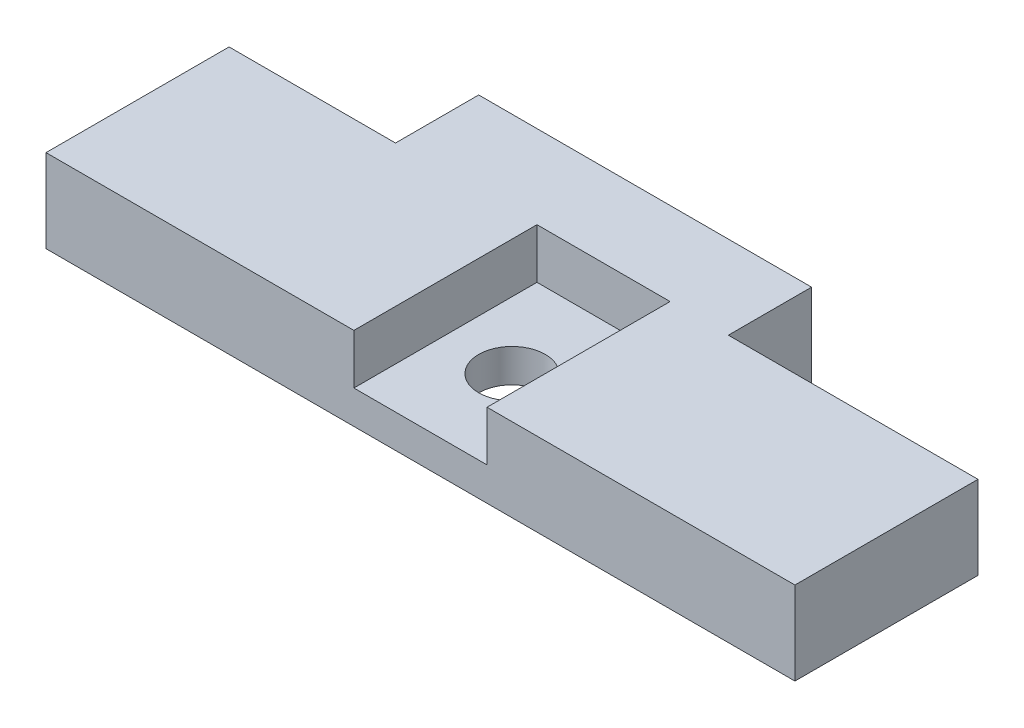
ISO-10303-21;
HEADER;
FILE_DESCRIPTION(('STEP AP214'),'2;1');
FILE_NAME('part.step','',(''),(''),'','','');
FILE_SCHEMA(('AUTOMOTIVE_DESIGN { 1 0 10303 214 1 1 1 1 }'));
ENDSEC;
DATA;
#1=APPLICATION_CONTEXT('core data for automotive mechanical design processes');
#2=APPLICATION_PROTOCOL_DEFINITION('international standard','automotive_design',2000,#1);
#3=PRODUCT_CONTEXT('',#1,'mechanical');
#4=PRODUCT('Part','Part','',(#3));
#5=PRODUCT_RELATED_PRODUCT_CATEGORY('part','',(#4));
#6=PRODUCT_DEFINITION_FORMATION('','',#4);
#7=PRODUCT_DEFINITION_CONTEXT('part definition',#1,'design');
#8=PRODUCT_DEFINITION('design','',#6,#7);
#9=PRODUCT_DEFINITION_SHAPE('','',#8);
#10=(LENGTH_UNIT() NAMED_UNIT(*) SI_UNIT(.MILLI.,.METRE.));
#11=(NAMED_UNIT(*) PLANE_ANGLE_UNIT() SI_UNIT($,.RADIAN.));
#12=(NAMED_UNIT(*) SI_UNIT($,.STERADIAN.) SOLID_ANGLE_UNIT());
#13=UNCERTAINTY_MEASURE_WITH_UNIT(LENGTH_MEASURE(1.E-05),#10,'distance_accuracy_value','');
#14=(GEOMETRIC_REPRESENTATION_CONTEXT(3) GLOBAL_UNCERTAINTY_ASSIGNED_CONTEXT((#13)) GLOBAL_UNIT_ASSIGNED_CONTEXT((#10,
#11,#12)) REPRESENTATION_CONTEXT('',''));
#15=CARTESIAN_POINT('',(0.,0.,0.));
#16=DIRECTION('',(0.,0.,1.));
#17=DIRECTION('',(1.,0.,0.));
#18=AXIS2_PLACEMENT_3D('',#15,#16,#17);
#19=CARTESIAN_POINT('',(22.5,5.,-3.));
#20=DIRECTION('',(-1.,0.,0.));
#21=DIRECTION('',(0.,0.,1.));
#22=AXIS2_PLACEMENT_3D('',#19,#20,#21);
#23=PLANE('',#22);
#24=DIRECTION('',(0.,0.,-1.));
#25=VECTOR('',#24,1.);
#26=CARTESIAN_POINT('',(22.5,0.,-3.));
#27=LINE('',#26,#25);
#28=CARTESIAN_POINT('',(22.5,0.,8.));
#29=VERTEX_POINT('',#28);
#30=CARTESIAN_POINT('',(22.5,0.,-3.));
#31=VERTEX_POINT('',#30);
#32=EDGE_CURVE('E144',#29,#31,#27,.T.);
#33=ORIENTED_EDGE('',*,*,#32,.T.);
#34=DIRECTION('',(0.,-1.,0.));
#35=VECTOR('',#34,1.);
#36=CARTESIAN_POINT('',(22.5,5.,-3.));
#37=LINE('',#36,#35);
#38=CARTESIAN_POINT('',(22.5,5.,-3.));
#39=VERTEX_POINT('',#38);
#40=EDGE_CURVE('E11',#39,#31,#37,.T.);
#41=ORIENTED_EDGE('',*,*,#40,.F.);
#42=DIRECTION('',(0.,0.,-1.));
#43=VECTOR('',#42,1.);
#44=CARTESIAN_POINT('',(22.5,5.,-3.));
#45=LINE('',#44,#43);
#46=CARTESIAN_POINT('',(22.5,5.,8.));
#47=VERTEX_POINT('',#46);
#48=EDGE_CURVE('E160',#47,#39,#45,.T.);
#49=ORIENTED_EDGE('',*,*,#48,.F.);
#50=DIRECTION('',(0.,-1.,0.));
#51=VECTOR('',#50,1.);
#52=CARTESIAN_POINT('',(22.5,5.,8.));
#53=LINE('',#52,#51);
#54=EDGE_CURVE('E143',#47,#29,#53,.T.);
#55=ORIENTED_EDGE('',*,*,#54,.T.);
#56=EDGE_LOOP('',(#33,#41,#49,#55));
#57=FACE_BOUND('',#56,.T.);
#58=ADVANCED_FACE('F33',(#57),#23,.F.);
#59=CARTESIAN_POINT('',(7.49999999999999,5.,-3.));
#60=DIRECTION('',(0.,0.,1.));
#61=DIRECTION('',(1.,0.,0.));
#62=AXIS2_PLACEMENT_3D('',#59,#60,#61);
#63=PLANE('',#62);
#64=DIRECTION('',(-1.,0.,0.));
#65=VECTOR('',#64,1.);
#66=CARTESIAN_POINT('',(7.49999999999999,0.,-3.));
#67=LINE('',#66,#65);
#68=CARTESIAN_POINT('',(7.49999999999999,0.,-3.));
#69=VERTEX_POINT('',#68);
#70=EDGE_CURVE('E147',#31,#69,#67,.T.);
#71=ORIENTED_EDGE('',*,*,#70,.T.);
#72=DIRECTION('',(0.,-1.,0.));
#73=VECTOR('',#72,1.);
#74=CARTESIAN_POINT('',(7.49999999999999,5.,-3.));
#75=LINE('',#74,#73);
#76=CARTESIAN_POINT('',(7.49999999999999,5.,-3.));
#77=VERTEX_POINT('',#76);
#78=EDGE_CURVE('E40',#77,#69,#75,.T.);
#79=ORIENTED_EDGE('',*,*,#78,.F.);
#80=DIRECTION('',(-1.,0.,0.));
#81=VECTOR('',#80,1.);
#82=CARTESIAN_POINT('',(7.49999999999999,5.,-3.));
#83=LINE('',#82,#81);
#84=EDGE_CURVE('E97',#39,#77,#83,.T.);
#85=ORIENTED_EDGE('',*,*,#84,.F.);
#86=ORIENTED_EDGE('',*,*,#40,.T.);
#87=EDGE_LOOP('',(#71,#79,#85,#86));
#88=FACE_BOUND('',#87,.T.);
#89=ADVANCED_FACE('F266',(#88),#63,.F.);
#90=CARTESIAN_POINT('',(7.49999999999999,5.,-8.));
#91=DIRECTION('',(-1.,0.,0.));
#92=DIRECTION('',(0.,0.,1.));
#93=AXIS2_PLACEMENT_3D('',#90,#91,#92);
#94=PLANE('',#93);
#95=DIRECTION('',(0.,0.,-1.));
#96=VECTOR('',#95,1.);
#97=CARTESIAN_POINT('',(7.49999999999999,0.,-8.));
#98=LINE('',#97,#96);
#99=CARTESIAN_POINT('',(7.49999999999999,0.,-8.));
#100=VERTEX_POINT('',#99);
#101=EDGE_CURVE('E150',#69,#100,#98,.T.);
#102=ORIENTED_EDGE('',*,*,#101,.T.);
#103=DIRECTION('',(0.,-1.,0.));
#104=VECTOR('',#103,1.);
#105=CARTESIAN_POINT('',(7.49999999999999,5.,-8.));
#106=LINE('',#105,#104);
#107=CARTESIAN_POINT('',(7.49999999999999,5.,-8.));
#108=VERTEX_POINT('',#107);
#109=EDGE_CURVE('E167',#108,#100,#106,.T.);
#110=ORIENTED_EDGE('',*,*,#109,.F.);
#111=DIRECTION('',(0.,0.,-1.));
#112=VECTOR('',#111,1.);
#113=CARTESIAN_POINT('',(7.49999999999999,5.,-8.));
#114=LINE('',#113,#112);
#115=EDGE_CURVE('E175',#77,#108,#114,.T.);
#116=ORIENTED_EDGE('',*,*,#115,.F.);
#117=ORIENTED_EDGE('',*,*,#78,.T.);
#118=EDGE_LOOP('',(#102,#110,#116,#117));
#119=FACE_BOUND('',#118,.T.);
#120=ADVANCED_FACE('F173',(#119),#94,.F.);
#121=CARTESIAN_POINT('',(-12.5,5.,-8.));
#122=DIRECTION('',(0.,0.,1.));
#123=DIRECTION('',(1.,0.,0.));
#124=AXIS2_PLACEMENT_3D('',#121,#122,#123);
#125=PLANE('',#124);
#126=DIRECTION('',(-1.,0.,0.));
#127=VECTOR('',#126,1.);
#128=CARTESIAN_POINT('',(-12.5,0.,-8.));
#129=LINE('',#128,#127);
#130=CARTESIAN_POINT('',(-12.5,0.,-8.));
#131=VERTEX_POINT('',#130);
#132=EDGE_CURVE('E152',#100,#131,#129,.T.);
#133=ORIENTED_EDGE('',*,*,#132,.T.);
#134=DIRECTION('',(0.,-1.,0.));
#135=VECTOR('',#134,1.);
#136=CARTESIAN_POINT('',(-12.5,5.,-8.));
#137=LINE('',#136,#135);
#138=CARTESIAN_POINT('',(-12.5,5.,-8.));
#139=VERTEX_POINT('',#138);
#140=EDGE_CURVE('E164',#139,#131,#137,.T.);
#141=ORIENTED_EDGE('',*,*,#140,.F.);
#142=DIRECTION('',(-1.,0.,0.));
#143=VECTOR('',#142,1.);
#144=CARTESIAN_POINT('',(-12.5,5.,-8.));
#145=LINE('',#144,#143);
#146=EDGE_CURVE('E187',#108,#139,#145,.T.);
#147=ORIENTED_EDGE('',*,*,#146,.F.);
#148=ORIENTED_EDGE('',*,*,#109,.T.);
#149=EDGE_LOOP('',(#133,#141,#147,#148));
#150=FACE_BOUND('',#149,.T.);
#151=ADVANCED_FACE('F183',(#150),#125,.F.);
#152=CARTESIAN_POINT('',(-12.5,5.,-8.));
#153=DIRECTION('',(1.,0.,0.));
#154=DIRECTION('',(0.,0.,-1.));
#155=AXIS2_PLACEMENT_3D('',#152,#153,#154);
#156=PLANE('',#155);
#157=DIRECTION('',(0.,0.,1.));
#158=VECTOR('',#157,1.);
#159=CARTESIAN_POINT('',(-12.5,0.,-8.));
#160=LINE('',#159,#158);
#161=CARTESIAN_POINT('',(-12.5,0.,-3.));
#162=VERTEX_POINT('',#161);
#163=EDGE_CURVE('E154',#131,#162,#160,.T.);
#164=ORIENTED_EDGE('',*,*,#163,.T.);
#165=DIRECTION('',(0.,-1.,0.));
#166=VECTOR('',#165,1.);
#167=CARTESIAN_POINT('',(-12.5,5.,-3.));
#168=LINE('',#167,#166);
#169=CARTESIAN_POINT('',(-12.5,5.,-3.));
#170=VERTEX_POINT('',#169);
#171=EDGE_CURVE('E133',#170,#162,#168,.T.);
#172=ORIENTED_EDGE('',*,*,#171,.F.);
#173=DIRECTION('',(0.,0.,1.));
#174=VECTOR('',#173,1.);
#175=CARTESIAN_POINT('',(-12.5,5.,-8.));
#176=LINE('',#175,#174);
#177=EDGE_CURVE('E121',#139,#170,#176,.T.);
#178=ORIENTED_EDGE('',*,*,#177,.F.);
#179=ORIENTED_EDGE('',*,*,#140,.T.);
#180=EDGE_LOOP('',(#164,#172,#178,#179));
#181=FACE_BOUND('',#180,.T.);
#182=ADVANCED_FACE('F186',(#181),#156,.F.);
#183=CARTESIAN_POINT('',(-12.5,5.,-3.));
#184=DIRECTION('',(0.,0.,1.));
#185=DIRECTION('',(1.,0.,0.));
#186=AXIS2_PLACEMENT_3D('',#183,#184,#185);
#187=PLANE('',#186);
#188=DIRECTION('',(-1.,0.,0.));
#189=VECTOR('',#188,1.);
#190=CARTESIAN_POINT('',(-12.5,0.,-3.));
#191=LINE('',#190,#189);
#192=CARTESIAN_POINT('',(-22.5,0.,-3.));
#193=VERTEX_POINT('',#192);
#194=EDGE_CURVE('E130',#162,#193,#191,.T.);
#195=ORIENTED_EDGE('',*,*,#194,.T.);
#196=DIRECTION('',(0.,-1.,0.));
#197=VECTOR('',#196,1.);
#198=CARTESIAN_POINT('',(-22.5,5.,-3.));
#199=LINE('',#198,#197);
#200=CARTESIAN_POINT('',(-22.5,5.,-3.));
#201=VERTEX_POINT('',#200);
#202=EDGE_CURVE('E127',#201,#193,#199,.T.);
#203=ORIENTED_EDGE('',*,*,#202,.F.);
#204=DIRECTION('',(-1.,0.,0.));
#205=VECTOR('',#204,1.);
#206=CARTESIAN_POINT('',(-12.5,5.,-3.));
#207=LINE('',#206,#205);
#208=EDGE_CURVE('E113',#170,#201,#207,.T.);
#209=ORIENTED_EDGE('',*,*,#208,.F.);
#210=ORIENTED_EDGE('',*,*,#171,.T.);
#211=EDGE_LOOP('',(#195,#203,#209,#210));
#212=FACE_BOUND('',#211,.T.);
#213=ADVANCED_FACE('F128',(#212),#187,.F.);
#214=CARTESIAN_POINT('',(-22.5,5.,-3.));
#215=DIRECTION('',(1.,0.,0.));
#216=DIRECTION('',(0.,0.,-1.));
#217=AXIS2_PLACEMENT_3D('',#214,#215,#216);
#218=PLANE('',#217);
#219=DIRECTION('',(0.,0.,1.));
#220=VECTOR('',#219,1.);
#221=CARTESIAN_POINT('',(-22.5,0.,-3.));
#222=LINE('',#221,#220);
#223=CARTESIAN_POINT('',(-22.5,0.,8.));
#224=VERTEX_POINT('',#223);
#225=EDGE_CURVE('E157',#193,#224,#222,.T.);
#226=ORIENTED_EDGE('',*,*,#225,.T.);
#227=DIRECTION('',(0.,-1.,0.));
#228=VECTOR('',#227,1.);
#229=CARTESIAN_POINT('',(-22.5,5.,8.));
#230=LINE('',#229,#228);
#231=CARTESIAN_POINT('',(-22.5,5.,8.));
#232=VERTEX_POINT('',#231);
#233=EDGE_CURVE('E134',#232,#224,#230,.T.);
#234=ORIENTED_EDGE('',*,*,#233,.F.);
#235=DIRECTION('',(0.,0.,1.));
#236=VECTOR('',#235,1.);
#237=CARTESIAN_POINT('',(-22.5,5.,-3.));
#238=LINE('',#237,#236);
#239=EDGE_CURVE('E118',#201,#232,#238,.T.);
#240=ORIENTED_EDGE('',*,*,#239,.F.);
#241=ORIENTED_EDGE('',*,*,#202,.T.);
#242=EDGE_LOOP('',(#226,#234,#240,#241));
#243=FACE_BOUND('',#242,.T.);
#244=ADVANCED_FACE('F136',(#243),#218,.F.);
#245=CARTESIAN_POINT('',(-22.5,5.,8.));
#246=DIRECTION('',(0.,0.,-1.));
#247=DIRECTION('',(-1.,0.,0.));
#248=AXIS2_PLACEMENT_3D('',#245,#246,#247);
#249=PLANE('',#248);
#250=DIRECTION('',(1.,0.,0.));
#251=VECTOR('',#250,1.);
#252=CARTESIAN_POINT('',(-22.5,5.,8.));
#253=LINE('',#252,#251);
#254=CARTESIAN_POINT('',(3.99999999999999,5.,8.));
#255=VERTEX_POINT('',#254);
#256=EDGE_CURVE('E55',#255,#47,#253,.T.);
#257=ORIENTED_EDGE('',*,*,#256,.F.);
#258=DIRECTION('',(0.,1.,0.));
#259=VECTOR('',#258,1.);
#260=CARTESIAN_POINT('',(3.99999999999999,2.,8.));
#261=LINE('',#260,#259);
#262=CARTESIAN_POINT('',(3.99999999999999,2.,8.));
#263=VERTEX_POINT('',#262);
#264=EDGE_CURVE('E148',#263,#255,#261,.T.);
#265=ORIENTED_EDGE('',*,*,#264,.F.);
#266=DIRECTION('',(1.,0.,0.));
#267=VECTOR('',#266,1.);
#268=CARTESIAN_POINT('',(3.99999999999999,2.,8.));
#269=LINE('',#268,#267);
#270=CARTESIAN_POINT('',(-3.99999999999999,2.,8.));
#271=VERTEX_POINT('',#270);
#272=EDGE_CURVE('E196',#271,#263,#269,.T.);
#273=ORIENTED_EDGE('',*,*,#272,.F.);
#274=DIRECTION('',(0.,1.,0.));
#275=VECTOR('',#274,1.);
#276=CARTESIAN_POINT('',(-3.99999999999999,2.,8.));
#277=LINE('',#276,#275);
#278=CARTESIAN_POINT('',(-3.99999999999999,5.,8.));
#279=VERTEX_POINT('',#278);
#280=EDGE_CURVE('E199',#271,#279,#277,.T.);
#281=ORIENTED_EDGE('',*,*,#280,.T.);
#282=EDGE_CURVE('E139',#232,#279,#253,.T.);
#283=ORIENTED_EDGE('',*,*,#282,.F.);
#284=ORIENTED_EDGE('',*,*,#233,.T.);
#285=DIRECTION('',(1.,0.,0.));
#286=VECTOR('',#285,1.);
#287=CARTESIAN_POINT('',(-22.5,0.,8.));
#288=LINE('',#287,#286);
#289=EDGE_CURVE('E89',#224,#29,#288,.T.);
#290=ORIENTED_EDGE('',*,*,#289,.T.);
#291=ORIENTED_EDGE('',*,*,#54,.F.);
#292=EDGE_LOOP('',(#257,#265,#273,#281,#283,#284,#290,#291));
#293=FACE_BOUND('',#292,.T.);
#294=ADVANCED_FACE('F262',(#293),#249,.F.);
#295=CARTESIAN_POINT('',(0.,5.,0.));
#296=DIRECTION('',(0.,1.,0.));
#297=DIRECTION('',(0.,0.,1.));
#298=AXIS2_PLACEMENT_3D('',#295,#296,#297);
#299=PLANE('',#298);
#300=DIRECTION('',(0.,0.,-1.));
#301=VECTOR('',#300,1.);
#302=CARTESIAN_POINT('',(3.99999999999999,5.,8.));
#303=LINE('',#302,#301);
#304=CARTESIAN_POINT('',(4.,5.,-3.));
#305=VERTEX_POINT('',#304);
#306=EDGE_CURVE('E47',#255,#305,#303,.T.);
#307=ORIENTED_EDGE('',*,*,#306,.F.);
#308=ORIENTED_EDGE('',*,*,#256,.T.);
#309=ORIENTED_EDGE('',*,*,#48,.T.);
#310=ORIENTED_EDGE('',*,*,#84,.T.);
#311=ORIENTED_EDGE('',*,*,#115,.T.);
#312=ORIENTED_EDGE('',*,*,#146,.T.);
#313=ORIENTED_EDGE('',*,*,#177,.T.);
#314=ORIENTED_EDGE('',*,*,#208,.T.);
#315=ORIENTED_EDGE('',*,*,#239,.T.);
#316=ORIENTED_EDGE('',*,*,#282,.T.);
#317=DIRECTION('',(0.,0.,1.));
#318=VECTOR('',#317,1.);
#319=CARTESIAN_POINT('',(-3.99999999999999,5.,8.));
#320=LINE('',#319,#318);
#321=CARTESIAN_POINT('',(-4.,5.,-3.));
#322=VERTEX_POINT('',#321);
#323=EDGE_CURVE('E203',#322,#279,#320,.T.);
#324=ORIENTED_EDGE('',*,*,#323,.F.);
#325=DIRECTION('',(-1.,0.,0.));
#326=VECTOR('',#325,1.);
#327=CARTESIAN_POINT('',(4.,5.,-3.));
#328=LINE('',#327,#326);
#329=EDGE_CURVE('E207',#305,#322,#328,.T.);
#330=ORIENTED_EDGE('',*,*,#329,.F.);
#331=EDGE_LOOP('',(#307,#308,#309,#310,#311,#312,#313,#314,#315,#316,#324,#330));
#332=FACE_BOUND('',#331,.T.);
#333=ADVANCED_FACE('F115',(#332),#299,.T.);
#334=CARTESIAN_POINT('',(0.,0.,0.));
#335=DIRECTION('',(0.,1.,0.));
#336=DIRECTION('',(0.,0.,1.));
#337=AXIS2_PLACEMENT_3D('',#334,#335,#336);
#338=PLANE('',#337);
#339=CARTESIAN_POINT('',(0.,0.,2.5));
#340=DIRECTION('',(0.,1.,0.));
#341=DIRECTION('',(0.,0.,1.));
#342=AXIS2_PLACEMENT_3D('',#339,#340,#341);
#343=CIRCLE('',#342,2.);
#344=CARTESIAN_POINT('',(0.,0.,4.5));
#345=VERTEX_POINT('',#344);
#346=EDGE_CURVE('E211',#345,#345,#343,.T.);
#347=ORIENTED_EDGE('',*,*,#346,.T.);
#348=EDGE_LOOP('',(#347));
#349=FACE_BOUND('',#348,.T.);
#350=ORIENTED_EDGE('',*,*,#32,.F.);
#351=ORIENTED_EDGE('',*,*,#289,.F.);
#352=ORIENTED_EDGE('',*,*,#225,.F.);
#353=ORIENTED_EDGE('',*,*,#194,.F.);
#354=ORIENTED_EDGE('',*,*,#163,.F.);
#355=ORIENTED_EDGE('',*,*,#132,.F.);
#356=ORIENTED_EDGE('',*,*,#101,.F.);
#357=ORIENTED_EDGE('',*,*,#70,.F.);
#358=EDGE_LOOP('',(#350,#351,#352,#353,#354,#355,#356,#357));
#359=FACE_BOUND('',#358,.T.);
#360=ADVANCED_FACE('F179',(#349,#359),#338,.F.);
#361=CARTESIAN_POINT('',(3.99999999999999,2.,8.));
#362=DIRECTION('',(1.,0.,0.));
#363=DIRECTION('',(0.,0.,-1.));
#364=AXIS2_PLACEMENT_3D('',#361,#362,#363);
#365=PLANE('',#364);
#366=ORIENTED_EDGE('',*,*,#306,.T.);
#367=DIRECTION('',(0.,1.,0.));
#368=VECTOR('',#367,1.);
#369=CARTESIAN_POINT('',(4.,2.,-3.));
#370=LINE('',#369,#368);
#371=CARTESIAN_POINT('',(4.,2.,-3.));
#372=VERTEX_POINT('',#371);
#373=EDGE_CURVE('E193',#372,#305,#370,.T.);
#374=ORIENTED_EDGE('',*,*,#373,.F.);
#375=DIRECTION('',(0.,0.,-1.));
#376=VECTOR('',#375,1.);
#377=CARTESIAN_POINT('',(3.99999999999999,2.,8.));
#378=LINE('',#377,#376);
#379=EDGE_CURVE('E206',#263,#372,#378,.T.);
#380=ORIENTED_EDGE('',*,*,#379,.F.);
#381=ORIENTED_EDGE('',*,*,#264,.T.);
#382=EDGE_LOOP('',(#366,#374,#380,#381));
#383=FACE_BOUND('',#382,.T.);
#384=ADVANCED_FACE('F247',(#383),#365,.F.);
#385=CARTESIAN_POINT('',(-3.99999999999999,2.,8.));
#386=DIRECTION('',(-1.,0.,0.));
#387=DIRECTION('',(0.,0.,1.));
#388=AXIS2_PLACEMENT_3D('',#385,#386,#387);
#389=PLANE('',#388);
#390=ORIENTED_EDGE('',*,*,#323,.T.);
#391=ORIENTED_EDGE('',*,*,#280,.F.);
#392=DIRECTION('',(0.,0.,1.));
#393=VECTOR('',#392,1.);
#394=CARTESIAN_POINT('',(-3.99999999999999,2.,8.));
#395=LINE('',#394,#393);
#396=CARTESIAN_POINT('',(-4.,2.,-3.));
#397=VERTEX_POINT('',#396);
#398=EDGE_CURVE('E214',#397,#271,#395,.T.);
#399=ORIENTED_EDGE('',*,*,#398,.F.);
#400=DIRECTION('',(0.,1.,0.));
#401=VECTOR('',#400,1.);
#402=CARTESIAN_POINT('',(-4.,2.,-3.));
#403=LINE('',#402,#401);
#404=EDGE_CURVE('E195',#397,#322,#403,.T.);
#405=ORIENTED_EDGE('',*,*,#404,.T.);
#406=EDGE_LOOP('',(#390,#391,#399,#405));
#407=FACE_BOUND('',#406,.T.);
#408=ADVANCED_FACE('F258',(#407),#389,.F.);
#409=CARTESIAN_POINT('',(4.,2.,-3.));
#410=DIRECTION('',(0.,0.,-1.));
#411=DIRECTION('',(-1.,0.,0.));
#412=AXIS2_PLACEMENT_3D('',#409,#410,#411);
#413=PLANE('',#412);
#414=ORIENTED_EDGE('',*,*,#329,.T.);
#415=ORIENTED_EDGE('',*,*,#404,.F.);
#416=DIRECTION('',(-1.,0.,0.));
#417=VECTOR('',#416,1.);
#418=CARTESIAN_POINT('',(4.,2.,-3.));
#419=LINE('',#418,#417);
#420=EDGE_CURVE('E217',#372,#397,#419,.T.);
#421=ORIENTED_EDGE('',*,*,#420,.F.);
#422=ORIENTED_EDGE('',*,*,#373,.T.);
#423=EDGE_LOOP('',(#414,#415,#421,#422));
#424=FACE_BOUND('',#423,.T.);
#425=ADVANCED_FACE('F238',(#424),#413,.F.);
#426=CARTESIAN_POINT('',(0.,2.,0.));
#427=DIRECTION('',(0.,1.,0.));
#428=DIRECTION('',(0.,0.,1.));
#429=AXIS2_PLACEMENT_3D('',#426,#427,#428);
#430=PLANE('',#429);
#431=CARTESIAN_POINT('',(0.,2.,2.5));
#432=DIRECTION('',(0.,1.,0.));
#433=DIRECTION('',(0.,0.,1.));
#434=AXIS2_PLACEMENT_3D('',#431,#432,#433);
#435=CIRCLE('',#434,2.);
#436=CARTESIAN_POINT('',(0.,2.,4.5));
#437=VERTEX_POINT('',#436);
#438=EDGE_CURVE('E222',#437,#437,#435,.T.);
#439=ORIENTED_EDGE('',*,*,#438,.F.);
#440=EDGE_LOOP('',(#439));
#441=FACE_BOUND('',#440,.T.);
#442=ORIENTED_EDGE('',*,*,#379,.T.);
#443=ORIENTED_EDGE('',*,*,#420,.T.);
#444=ORIENTED_EDGE('',*,*,#398,.T.);
#445=ORIENTED_EDGE('',*,*,#272,.T.);
#446=EDGE_LOOP('',(#442,#443,#444,#445));
#447=FACE_BOUND('',#446,.T.);
#448=ADVANCED_FACE('F232',(#441,#447),#430,.T.);
#449=CARTESIAN_POINT('',(0.,0.,2.5));
#450=DIRECTION('',(0.,1.,0.));
#451=DIRECTION('',(0.,0.,1.));
#452=AXIS2_PLACEMENT_3D('',#449,#450,#451);
#453=CYLINDRICAL_SURFACE('',#452,2.);
#454=ORIENTED_EDGE('',*,*,#346,.F.);
#455=EDGE_LOOP('',(#454));
#456=FACE_BOUND('',#455,.T.);
#457=ORIENTED_EDGE('',*,*,#438,.T.);
#458=EDGE_LOOP('',(#457));
#459=FACE_BOUND('',#458,.T.);
#460=ADVANCED_FACE('F229',(#456,#459),#453,.F.);
#461=CLOSED_SHELL('',(#58,#89,#120,#151,#182,#213,#244,#294,#333,#360,#384,#408,#425,#448,#460));
#462=MANIFOLD_SOLID_BREP('B2',#461);
#463=ADVANCED_BREP_SHAPE_REPRESENTATION('',(#18,#462),#14);
#464=SHAPE_DEFINITION_REPRESENTATION(#9,#463);
ENDSEC;
END-ISO-10303-21;
